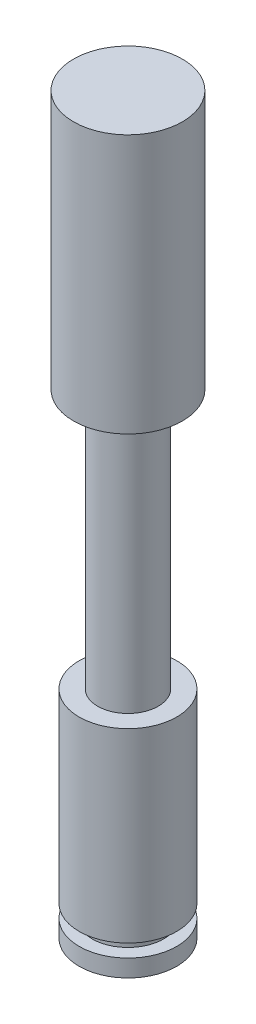
ISO-10303-21;
HEADER;
FILE_DESCRIPTION(('STEP AP214'),'2;1');
FILE_NAME('part.step','',(''),(''),'','','');
FILE_SCHEMA(('AUTOMOTIVE_DESIGN { 1 0 10303 214 1 1 1 1 }'));
ENDSEC;
DATA;
#1=APPLICATION_CONTEXT('core data for automotive mechanical design processes');
#2=APPLICATION_PROTOCOL_DEFINITION('international standard','automotive_design',2000,#1);
#3=PRODUCT_CONTEXT('',#1,'mechanical');
#4=PRODUCT('Part','Part','',(#3));
#5=PRODUCT_RELATED_PRODUCT_CATEGORY('part','',(#4));
#6=PRODUCT_DEFINITION_FORMATION('','',#4);
#7=PRODUCT_DEFINITION_CONTEXT('part definition',#1,'design');
#8=PRODUCT_DEFINITION('design','',#6,#7);
#9=PRODUCT_DEFINITION_SHAPE('','',#8);
#10=(LENGTH_UNIT() NAMED_UNIT(*) SI_UNIT(.MILLI.,.METRE.));
#11=(NAMED_UNIT(*) PLANE_ANGLE_UNIT() SI_UNIT($,.RADIAN.));
#12=(NAMED_UNIT(*) SI_UNIT($,.STERADIAN.) SOLID_ANGLE_UNIT());
#13=UNCERTAINTY_MEASURE_WITH_UNIT(LENGTH_MEASURE(1.E-05),#10,'distance_accuracy_value','');
#14=(GEOMETRIC_REPRESENTATION_CONTEXT(3) GLOBAL_UNCERTAINTY_ASSIGNED_CONTEXT((#13)) GLOBAL_UNIT_ASSIGNED_CONTEXT((#10,
#11,#12)) REPRESENTATION_CONTEXT('',''));
#15=CARTESIAN_POINT('',(0.,0.,0.));
#16=DIRECTION('',(0.,0.,1.));
#17=DIRECTION('',(1.,0.,0.));
#18=AXIS2_PLACEMENT_3D('',#15,#16,#17);
#19=CARTESIAN_POINT('',(0.,25.,0.));
#20=DIRECTION('',(0.,1.,0.));
#21=DIRECTION('',(0.,0.,1.));
#22=AXIS2_PLACEMENT_3D('',#19,#20,#21);
#23=PLANE('',#22);
#24=CARTESIAN_POINT('',(0.,25.,0.));
#25=DIRECTION('',(0.,1.,0.));
#26=DIRECTION('',(0.,0.,1.));
#27=AXIS2_PLACEMENT_3D('',#24,#25,#26);
#28=CIRCLE('',#27,5.65);
#29=CARTESIAN_POINT('',(0.,25.,5.65));
#30=VERTEX_POINT('',#29);
#31=EDGE_CURVE('E47',#30,#30,#28,.T.);
#32=ORIENTED_EDGE('',*,*,#31,.T.);
#33=EDGE_LOOP('',(#32));
#34=FACE_BOUND('',#33,.T.);
#35=CARTESIAN_POINT('',(0.,25.,0.));
#36=DIRECTION('',(0.,1.,0.));
#37=DIRECTION('',(0.,0.,1.));
#38=AXIS2_PLACEMENT_3D('',#35,#36,#37);
#39=CIRCLE('',#38,3.5);
#40=CARTESIAN_POINT('',(0.,25.,3.5));
#41=VERTEX_POINT('',#40);
#42=EDGE_CURVE('E56',#41,#41,#39,.T.);
#43=ORIENTED_EDGE('',*,*,#42,.F.);
#44=EDGE_LOOP('',(#43));
#45=FACE_BOUND('',#44,.T.);
#46=ADVANCED_FACE('F31',(#34,#45),#23,.T.);
#47=CARTESIAN_POINT('',(0.,2.,0.));
#48=DIRECTION('',(0.,1.,0.));
#49=DIRECTION('',(0.,0.,1.));
#50=AXIS2_PLACEMENT_3D('',#47,#48,#49);
#51=PLANE('',#50);
#52=CARTESIAN_POINT('',(0.,2.,0.));
#53=DIRECTION('',(0.,1.,0.));
#54=DIRECTION('',(0.,0.,1.));
#55=AXIS2_PLACEMENT_3D('',#52,#53,#54);
#56=CIRCLE('',#55,5.65);
#57=CARTESIAN_POINT('',(0.,2.,5.65));
#58=VERTEX_POINT('',#57);
#59=EDGE_CURVE('E10',#58,#58,#56,.T.);
#60=ORIENTED_EDGE('',*,*,#59,.T.);
#61=EDGE_LOOP('',(#60));
#62=FACE_BOUND('',#61,.T.);
#63=CARTESIAN_POINT('',(0.,2.,0.));
#64=DIRECTION('',(0.,1.,0.));
#65=DIRECTION('',(0.,0.,1.));
#66=AXIS2_PLACEMENT_3D('',#63,#64,#65);
#67=CIRCLE('',#66,4.15);
#68=CARTESIAN_POINT('',(0.,2.,4.15));
#69=VERTEX_POINT('',#68);
#70=EDGE_CURVE('E44',#69,#69,#67,.T.);
#71=ORIENTED_EDGE('',*,*,#70,.F.);
#72=EDGE_LOOP('',(#71));
#73=FACE_BOUND('',#72,.T.);
#74=ADVANCED_FACE('F90',(#62,#73),#51,.T.);
#75=CARTESIAN_POINT('',(0.,2.,0.));
#76=DIRECTION('',(0.,-1.,0.));
#77=DIRECTION('',(0.,0.,-1.));
#78=AXIS2_PLACEMENT_3D('',#75,#76,#77);
#79=CYLINDRICAL_SURFACE('',#78,5.65);
#80=ORIENTED_EDGE('',*,*,#59,.F.);
#81=EDGE_LOOP('',(#80));
#82=FACE_BOUND('',#81,.T.);
#83=CARTESIAN_POINT('',(0.,0.,0.));
#84=DIRECTION('',(0.,1.,0.));
#85=DIRECTION('',(0.,0.,1.));
#86=AXIS2_PLACEMENT_3D('',#83,#84,#85);
#87=CIRCLE('',#86,5.65);
#88=CARTESIAN_POINT('',(0.,0.,5.65));
#89=VERTEX_POINT('',#88);
#90=EDGE_CURVE('E35',#89,#89,#87,.T.);
#91=ORIENTED_EDGE('',*,*,#90,.T.);
#92=EDGE_LOOP('',(#91));
#93=FACE_BOUND('',#92,.T.);
#94=ADVANCED_FACE('F33',(#82,#93),#79,.T.);
#95=CARTESIAN_POINT('',(0.,0.,0.));
#96=DIRECTION('',(0.,1.,0.));
#97=DIRECTION('',(0.,0.,1.));
#98=AXIS2_PLACEMENT_3D('',#95,#96,#97);
#99=PLANE('',#98);
#100=ORIENTED_EDGE('',*,*,#90,.F.);
#101=EDGE_LOOP('',(#100));
#102=FACE_BOUND('',#101,.T.);
#103=ADVANCED_FACE('F107',(#102),#99,.F.);
#104=CARTESIAN_POINT('',(0.,3.5,0.));
#105=DIRECTION('',(0.,-1.,0.));
#106=DIRECTION('',(0.,0.,-1.));
#107=AXIS2_PLACEMENT_3D('',#104,#105,#106);
#108=CYLINDRICAL_SURFACE('',#107,4.15);
#109=CARTESIAN_POINT('',(0.,3.5,0.));
#110=DIRECTION('',(0.,1.,0.));
#111=DIRECTION('',(0.,0.,1.));
#112=AXIS2_PLACEMENT_3D('',#109,#110,#111);
#113=CIRCLE('',#112,4.15);
#114=CARTESIAN_POINT('',(0.,3.5,4.15));
#115=VERTEX_POINT('',#114);
#116=EDGE_CURVE('E42',#115,#115,#113,.T.);
#117=ORIENTED_EDGE('',*,*,#116,.F.);
#118=EDGE_LOOP('',(#117));
#119=FACE_BOUND('',#118,.T.);
#120=ORIENTED_EDGE('',*,*,#70,.T.);
#121=EDGE_LOOP('',(#120));
#122=FACE_BOUND('',#121,.T.);
#123=ADVANCED_FACE('F101',(#119,#122),#108,.T.);
#124=CARTESIAN_POINT('',(0.,3.5,0.));
#125=DIRECTION('',(0.,1.,0.));
#126=DIRECTION('',(0.,0.,1.));
#127=AXIS2_PLACEMENT_3D('',#124,#125,#126);
#128=PLANE('',#127);
#129=CARTESIAN_POINT('',(0.,3.5,0.));
#130=DIRECTION('',(0.,1.,0.));
#131=DIRECTION('',(0.,0.,1.));
#132=AXIS2_PLACEMENT_3D('',#129,#130,#131);
#133=CIRCLE('',#132,5.65);
#134=CARTESIAN_POINT('',(0.,3.5,5.65));
#135=VERTEX_POINT('',#134);
#136=EDGE_CURVE('E50',#135,#135,#133,.T.);
#137=ORIENTED_EDGE('',*,*,#136,.F.);
#138=EDGE_LOOP('',(#137));
#139=FACE_BOUND('',#138,.T.);
#140=ORIENTED_EDGE('',*,*,#116,.T.);
#141=EDGE_LOOP('',(#140));
#142=FACE_BOUND('',#141,.T.);
#143=ADVANCED_FACE('F98',(#139,#142),#128,.F.);
#144=CARTESIAN_POINT('',(0.,25.,0.));
#145=DIRECTION('',(0.,-1.,0.));
#146=DIRECTION('',(0.,0.,-1.));
#147=AXIS2_PLACEMENT_3D('',#144,#145,#146);
#148=CYLINDRICAL_SURFACE('',#147,5.65);
#149=ORIENTED_EDGE('',*,*,#31,.F.);
#150=EDGE_LOOP('',(#149));
#151=FACE_BOUND('',#150,.T.);
#152=ORIENTED_EDGE('',*,*,#136,.T.);
#153=EDGE_LOOP('',(#152));
#154=FACE_BOUND('',#153,.T.);
#155=ADVANCED_FACE('F85',(#151,#154),#148,.T.);
#156=CARTESIAN_POINT('',(0.,55.,0.));
#157=DIRECTION('',(0.,-1.,0.));
#158=DIRECTION('',(0.,0.,-1.));
#159=AXIS2_PLACEMENT_3D('',#156,#157,#158);
#160=CYLINDRICAL_SURFACE('',#159,3.5);
#161=CARTESIAN_POINT('',(0.,55.,0.));
#162=DIRECTION('',(0.,1.,0.));
#163=DIRECTION('',(0.,0.,1.));
#164=AXIS2_PLACEMENT_3D('',#161,#162,#163);
#165=CIRCLE('',#164,3.5);
#166=CARTESIAN_POINT('',(0.,55.,3.5));
#167=VERTEX_POINT('',#166);
#168=EDGE_CURVE('E53',#167,#167,#165,.T.);
#169=ORIENTED_EDGE('',*,*,#168,.F.);
#170=EDGE_LOOP('',(#169));
#171=FACE_BOUND('',#170,.T.);
#172=ORIENTED_EDGE('',*,*,#42,.T.);
#173=EDGE_LOOP('',(#172));
#174=FACE_BOUND('',#173,.T.);
#175=ADVANCED_FACE('F79',(#171,#174),#160,.T.);
#176=CARTESIAN_POINT('',(0.,55.,0.));
#177=DIRECTION('',(0.,1.,0.));
#178=DIRECTION('',(0.,0.,1.));
#179=AXIS2_PLACEMENT_3D('',#176,#177,#178);
#180=PLANE('',#179);
#181=CARTESIAN_POINT('',(0.,55.,0.));
#182=DIRECTION('',(0.,1.,0.));
#183=DIRECTION('',(0.,0.,1.));
#184=AXIS2_PLACEMENT_3D('',#181,#182,#183);
#185=CIRCLE('',#184,6.3);
#186=CARTESIAN_POINT('',(0.,55.,6.3));
#187=VERTEX_POINT('',#186);
#188=EDGE_CURVE('E62',#187,#187,#185,.T.);
#189=ORIENTED_EDGE('',*,*,#188,.F.);
#190=EDGE_LOOP('',(#189));
#191=FACE_BOUND('',#190,.T.);
#192=ORIENTED_EDGE('',*,*,#168,.T.);
#193=EDGE_LOOP('',(#192));
#194=FACE_BOUND('',#193,.T.);
#195=ADVANCED_FACE('F73',(#191,#194),#180,.F.);
#196=CARTESIAN_POINT('',(0.,85.,0.));
#197=DIRECTION('',(0.,-1.,0.));
#198=DIRECTION('',(0.,0.,-1.));
#199=AXIS2_PLACEMENT_3D('',#196,#197,#198);
#200=CYLINDRICAL_SURFACE('',#199,6.3);
#201=CARTESIAN_POINT('',(0.,85.,0.));
#202=DIRECTION('',(0.,1.,0.));
#203=DIRECTION('',(0.,0.,1.));
#204=AXIS2_PLACEMENT_3D('',#201,#202,#203);
#205=CIRCLE('',#204,6.3);
#206=CARTESIAN_POINT('',(0.,85.,6.3));
#207=VERTEX_POINT('',#206);
#208=EDGE_CURVE('E59',#207,#207,#205,.T.);
#209=ORIENTED_EDGE('',*,*,#208,.F.);
#210=EDGE_LOOP('',(#209));
#211=FACE_BOUND('',#210,.T.);
#212=ORIENTED_EDGE('',*,*,#188,.T.);
#213=EDGE_LOOP('',(#212));
#214=FACE_BOUND('',#213,.T.);
#215=ADVANCED_FACE('F70',(#211,#214),#200,.T.);
#216=CARTESIAN_POINT('',(0.,85.,0.));
#217=DIRECTION('',(0.,1.,0.));
#218=DIRECTION('',(0.,0.,1.));
#219=AXIS2_PLACEMENT_3D('',#216,#217,#218);
#220=PLANE('',#219);
#221=ORIENTED_EDGE('',*,*,#208,.T.);
#222=EDGE_LOOP('',(#221));
#223=FACE_BOUND('',#222,.T.);
#224=ADVANCED_FACE('F68',(#223),#220,.T.);
#225=CLOSED_SHELL('',(#46,#74,#94,#103,#123,#143,#155,#175,#195,#215,#224));
#226=MANIFOLD_SOLID_BREP('B2',#225);
#227=ADVANCED_BREP_SHAPE_REPRESENTATION('',(#18,#226),#14);
#228=SHAPE_DEFINITION_REPRESENTATION(#9,#227);
ENDSEC;
END-ISO-10303-21;
